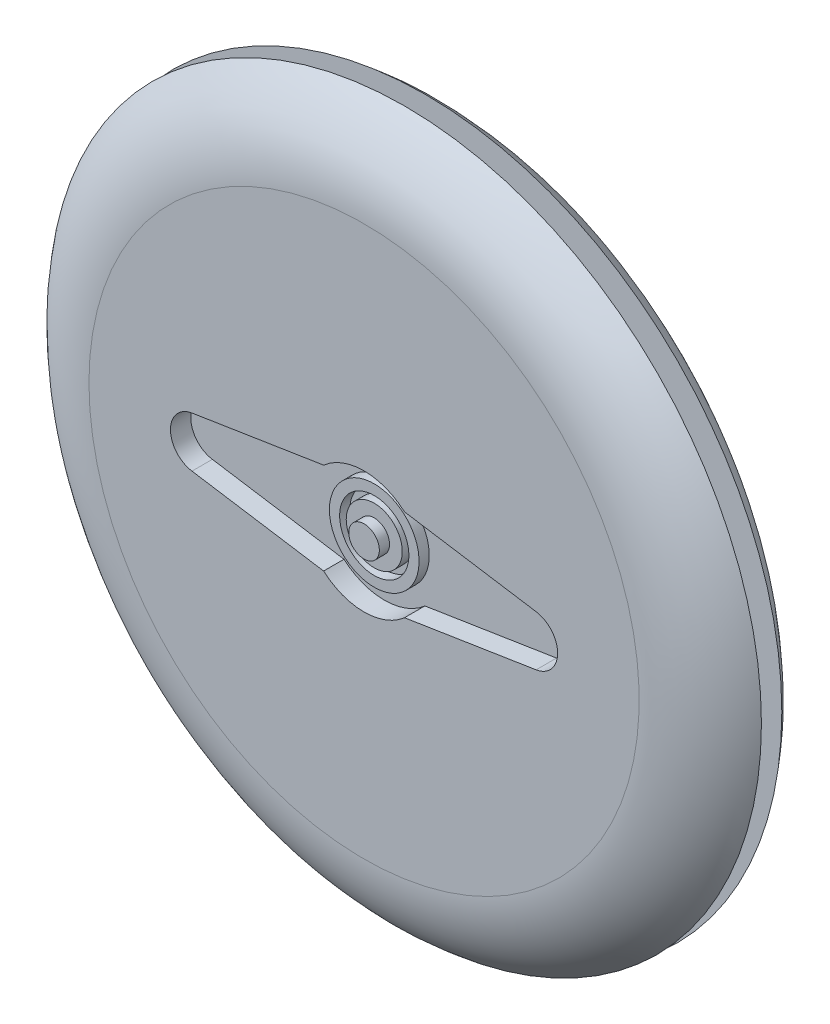
ISO-10303-21;
HEADER;
FILE_DESCRIPTION(('STEP AP214'),'2;1');
FILE_NAME('part.step','',(''),(''),'','','');
FILE_SCHEMA(('AUTOMOTIVE_DESIGN { 1 0 10303 214 1 1 1 1 }'));
ENDSEC;
DATA;
#1=APPLICATION_CONTEXT('core data for automotive mechanical design processes');
#2=APPLICATION_PROTOCOL_DEFINITION('international standard','automotive_design',2000,#1);
#3=PRODUCT_CONTEXT('',#1,'mechanical');
#4=PRODUCT('Part','Part','',(#3));
#5=PRODUCT_RELATED_PRODUCT_CATEGORY('part','',(#4));
#6=PRODUCT_DEFINITION_FORMATION('','',#4);
#7=PRODUCT_DEFINITION_CONTEXT('part definition',#1,'design');
#8=PRODUCT_DEFINITION('design','',#6,#7);
#9=PRODUCT_DEFINITION_SHAPE('','',#8);
#10=(LENGTH_UNIT() NAMED_UNIT(*) SI_UNIT(.MILLI.,.METRE.));
#11=(NAMED_UNIT(*) PLANE_ANGLE_UNIT() SI_UNIT($,.RADIAN.));
#12=(NAMED_UNIT(*) SI_UNIT($,.STERADIAN.) SOLID_ANGLE_UNIT());
#13=UNCERTAINTY_MEASURE_WITH_UNIT(LENGTH_MEASURE(1.E-05),#10,'distance_accuracy_value','');
#14=(GEOMETRIC_REPRESENTATION_CONTEXT(3) GLOBAL_UNCERTAINTY_ASSIGNED_CONTEXT((#13)) GLOBAL_UNIT_ASSIGNED_CONTEXT((#10,
#11,#12)) REPRESENTATION_CONTEXT('',''));
#15=CARTESIAN_POINT('',(0.,0.,0.));
#16=DIRECTION('',(0.,0.,1.));
#17=DIRECTION('',(1.,0.,0.));
#18=AXIS2_PLACEMENT_3D('',#15,#16,#17);
#19=CARTESIAN_POINT('',(0.,0.,-4.));
#20=DIRECTION('',(0.,0.,1.));
#21=DIRECTION('',(-1.,0.,0.));
#22=AXIS2_PLACEMENT_3D('',#19,#20,#21);
#23=PLANE('',#22);
#24=CARTESIAN_POINT('',(0.,0.,-4.));
#25=DIRECTION('',(0.,0.,-1.));
#26=DIRECTION('',(-1.,0.,0.));
#27=AXIS2_PLACEMENT_3D('',#24,#25,#26);
#28=CIRCLE('',#27,35.);
#29=CARTESIAN_POINT('',(-35.,0.,-4.));
#30=VERTEX_POINT('',#29);
#31=EDGE_CURVE('E587',#30,#30,#28,.T.);
#32=ORIENTED_EDGE('',*,*,#31,.F.);
#33=EDGE_LOOP('',(#32));
#34=FACE_BOUND('',#33,.T.);
#35=ADVANCED_FACE('F585',(#34),#23,.T.);
#36=CARTESIAN_POINT('',(0.,0.,-8.));
#37=DIRECTION('',(0.,0.,1.));
#38=DIRECTION('',(-1.,0.,0.));
#39=AXIS2_PLACEMENT_3D('',#36,#37,#38);
#40=PLANE('',#39);
#41=CARTESIAN_POINT('',(0.,0.,-8.));
#42=DIRECTION('',(0.,0.,-1.));
#43=DIRECTION('',(-1.,0.,0.));
#44=AXIS2_PLACEMENT_3D('',#41,#42,#43);
#45=CIRCLE('',#44,27.);
#46=CARTESIAN_POINT('',(-27.,0.,-8.));
#47=VERTEX_POINT('',#46);
#48=EDGE_CURVE('E12',#47,#47,#45,.F.);
#49=ORIENTED_EDGE('',*,*,#48,.F.);
#50=EDGE_LOOP('',(#49));
#51=FACE_BOUND('',#50,.T.);
#52=ADVANCED_FACE('F596',(#51),#40,.F.);
#53=CARTESIAN_POINT('',(0.,0.,2.));
#54=DIRECTION('',(0.,0.,-1.));
#55=DIRECTION('',(1.,0.,0.));
#56=AXIS2_PLACEMENT_3D('',#53,#54,#55);
#57=TOROIDAL_SURFACE('',#56,27.,10.);
#58=ORIENTED_EDGE('',*,*,#48,.T.);
#59=EDGE_LOOP('',(#58));
#60=FACE_BOUND('',#59,.T.);
#61=ORIENTED_EDGE('',*,*,#31,.T.);
#62=EDGE_LOOP('',(#61));
#63=FACE_BOUND('',#62,.T.);
#64=ADVANCED_FACE('F582',(#60,#63),#57,.T.);
#65=CLOSED_SHELL('',(#35,#52,#64));
#66=MANIFOLD_SOLID_BREP('B2',#65);
#67=CARTESIAN_POINT('',(0.,0.,0.));
#68=DIRECTION('',(0.,0.,-1.));
#69=DIRECTION('',(-1.,0.,0.));
#70=AXIS2_PLACEMENT_3D('',#67,#68,#69);
#71=PLANE('',#70);
#72=CARTESIAN_POINT('',(0.,0.,0.));
#73=DIRECTION('',(0.,0.,-1.));
#74=DIRECTION('',(-1.,0.,0.));
#75=AXIS2_PLACEMENT_3D('',#72,#73,#74);
#76=CIRCLE('',#75,2.75);
#77=CARTESIAN_POINT('',(-2.75,0.,0.));
#78=VERTEX_POINT('',#77);
#79=EDGE_CURVE('E740',#78,#78,#76,.T.);
#80=ORIENTED_EDGE('',*,*,#79,.T.);
#81=EDGE_LOOP('',(#80));
#82=FACE_BOUND('',#81,.T.);
#83=CARTESIAN_POINT('',(0.,0.,0.));
#84=DIRECTION('',(0.,0.,-1.));
#85=DIRECTION('',(-1.,0.,0.));
#86=AXIS2_PLACEMENT_3D('',#83,#84,#85);
#87=CIRCLE('',#86,3.4);
#88=CARTESIAN_POINT('',(-3.4,0.,0.));
#89=VERTEX_POINT('',#88);
#90=EDGE_CURVE('E728',#89,#89,#87,.T.);
#91=ORIENTED_EDGE('',*,*,#90,.F.);
#92=EDGE_LOOP('',(#91));
#93=FACE_BOUND('',#92,.T.);
#94=ADVANCED_FACE('F627',(#82,#93),#71,.F.);
#95=CARTESIAN_POINT('',(0.,0.,1.));
#96=DIRECTION('',(0.,0.,-1.));
#97=DIRECTION('',(-1.,0.,0.));
#98=AXIS2_PLACEMENT_3D('',#95,#96,#97);
#99=PLANE('',#98);
#100=CARTESIAN_POINT('',(0.,0.,1.));
#101=DIRECTION('',(0.,0.,-1.));
#102=DIRECTION('',(-1.,0.,0.));
#103=AXIS2_PLACEMENT_3D('',#100,#101,#102);
#104=CIRCLE('',#103,3.4);
#105=CARTESIAN_POINT('',(-3.4,0.,1.));
#106=VERTEX_POINT('',#105);
#107=EDGE_CURVE('E722',#106,#106,#104,.T.);
#108=ORIENTED_EDGE('',*,*,#107,.T.);
#109=EDGE_LOOP('',(#108));
#110=FACE_BOUND('',#109,.T.);
#111=CARTESIAN_POINT('',(0.,0.,1.));
#112=DIRECTION('',(0.,0.,-1.));
#113=DIRECTION('',(-1.,0.,0.));
#114=AXIS2_PLACEMENT_3D('',#111,#112,#113);
#115=CIRCLE('',#114,4.4);
#116=CARTESIAN_POINT('',(-4.4,0.,1.));
#117=VERTEX_POINT('',#116);
#118=EDGE_CURVE('E720',#117,#117,#115,.T.);
#119=ORIENTED_EDGE('',*,*,#118,.F.);
#120=EDGE_LOOP('',(#119));
#121=FACE_BOUND('',#120,.T.);
#122=ADVANCED_FACE('F833',(#110,#121),#99,.F.);
#123=CARTESIAN_POINT('',(0.,0.,1.));
#124=DIRECTION('',(0.,0.,-1.));
#125=DIRECTION('',(-1.,0.,0.));
#126=AXIS2_PLACEMENT_3D('',#123,#124,#125);
#127=CYLINDRICAL_SURFACE('',#126,4.4);
#128=ORIENTED_EDGE('',*,*,#118,.T.);
#129=EDGE_LOOP('',(#128));
#130=FACE_BOUND('',#129,.T.);
#131=CARTESIAN_POINT('',(0.,0.,0.));
#132=DIRECTION('',(0.,0.,-1.));
#133=DIRECTION('',(-1.,0.,0.));
#134=AXIS2_PLACEMENT_3D('',#131,#132,#133);
#135=CIRCLE('',#134,4.4);
#136=CARTESIAN_POINT('',(-4.4,0.,0.));
#137=VERTEX_POINT('',#136);
#138=EDGE_CURVE('E730',#137,#137,#135,.T.);
#139=ORIENTED_EDGE('',*,*,#138,.F.);
#140=EDGE_LOOP('',(#139));
#141=FACE_BOUND('',#140,.T.);
#142=ADVANCED_FACE('F836',(#130,#141),#127,.T.);
#143=CARTESIAN_POINT('',(0.,0.,1.));
#144=DIRECTION('',(0.,0.,-1.));
#145=DIRECTION('',(-1.,0.,0.));
#146=AXIS2_PLACEMENT_3D('',#143,#144,#145);
#147=CYLINDRICAL_SURFACE('',#146,3.4);
#148=ORIENTED_EDGE('',*,*,#107,.F.);
#149=EDGE_LOOP('',(#148));
#150=FACE_BOUND('',#149,.T.);
#151=ORIENTED_EDGE('',*,*,#90,.T.);
#152=EDGE_LOOP('',(#151));
#153=FACE_BOUND('',#152,.T.);
#154=ADVANCED_FACE('F857',(#150,#153),#147,.F.);
#155=CARTESIAN_POINT('',(0.,0.,1.));
#156=DIRECTION('',(0.,0.,-1.));
#157=DIRECTION('',(-1.,0.,0.));
#158=AXIS2_PLACEMENT_3D('',#155,#156,#157);
#159=PLANE('',#158);
#160=CARTESIAN_POINT('',(0.,0.,1.));
#161=DIRECTION('',(0.,0.,-1.));
#162=DIRECTION('',(-1.,0.,0.));
#163=AXIS2_PLACEMENT_3D('',#160,#161,#162);
#164=CIRCLE('',#163,1.5);
#165=CARTESIAN_POINT('',(-1.5,0.,1.));
#166=VERTEX_POINT('',#165);
#167=EDGE_CURVE('E739',#166,#166,#164,.F.);
#168=ORIENTED_EDGE('',*,*,#167,.F.);
#169=EDGE_LOOP('',(#168));
#170=FACE_BOUND('',#169,.T.);
#171=CARTESIAN_POINT('',(0.,0.,1.));
#172=DIRECTION('',(0.,0.,-1.));
#173=DIRECTION('',(-1.,0.,0.));
#174=AXIS2_PLACEMENT_3D('',#171,#172,#173);
#175=CIRCLE('',#174,2.75);
#176=CARTESIAN_POINT('',(-2.75,0.,1.));
#177=VERTEX_POINT('',#176);
#178=EDGE_CURVE('E735',#177,#177,#175,.T.);
#179=ORIENTED_EDGE('',*,*,#178,.F.);
#180=EDGE_LOOP('',(#179));
#181=FACE_BOUND('',#180,.T.);
#182=ADVANCED_FACE('F861',(#170,#181),#159,.F.);
#183=CARTESIAN_POINT('',(0.,0.,1.));
#184=DIRECTION('',(0.,0.,-1.));
#185=DIRECTION('',(-1.,0.,0.));
#186=AXIS2_PLACEMENT_3D('',#183,#184,#185);
#187=CYLINDRICAL_SURFACE('',#186,2.75);
#188=ORIENTED_EDGE('',*,*,#178,.T.);
#189=EDGE_LOOP('',(#188));
#190=FACE_BOUND('',#189,.T.);
#191=ORIENTED_EDGE('',*,*,#79,.F.);
#192=EDGE_LOOP('',(#191));
#193=FACE_BOUND('',#192,.T.);
#194=ADVANCED_FACE('F862',(#190,#193),#187,.T.);
#195=CARTESIAN_POINT('',(3.96862696659689,4.5,2.3));
#196=DIRECTION('',(-0.155245679095352,-0.987875892570632,0.));
#197=DIRECTION('',(0.987875892570632,-0.155245679095352,0.));
#198=AXIS2_PLACEMENT_3D('',#195,#196,#197);
#199=PLANE('',#198);
#200=DIRECTION('',(-0.987875892570632,0.155245679095352,0.));
#201=VECTOR('',#200,1.);
#202=CARTESIAN_POINT('',(0.785784342221698,5.00018688419348,2.));
#203=LINE('',#202,#201);
#204=CARTESIAN_POINT('',(16.8881141977384,2.46968973142658,2.));
#205=VERTEX_POINT('',#204);
#206=CARTESIAN_POINT('',(3.96862696659689,4.5,2.));
#207=VERTEX_POINT('',#206);
#208=EDGE_CURVE('E705',#205,#207,#203,.T.);
#209=ORIENTED_EDGE('',*,*,#208,.T.);
#210=DIRECTION('',(0.,0.,-1.));
#211=VECTOR('',#210,1.);
#212=CARTESIAN_POINT('',(3.96862696659689,4.5,2.3));
#213=LINE('',#212,#211);
#214=CARTESIAN_POINT('',(3.96862696659689,4.5,0.));
#215=VERTEX_POINT('',#214);
#216=EDGE_CURVE('E770',#207,#215,#213,.T.);
#217=ORIENTED_EDGE('',*,*,#216,.T.);
#218=DIRECTION('',(-0.987875892570632,0.155245679095352,0.));
#219=VECTOR('',#218,1.);
#220=CARTESIAN_POINT('',(3.96862696659689,4.5,0.));
#221=LINE('',#220,#219);
#222=CARTESIAN_POINT('',(16.8881141977384,2.46968973142658,0.));
#223=VERTEX_POINT('',#222);
#224=EDGE_CURVE('E716',#223,#215,#221,.T.);
#225=ORIENTED_EDGE('',*,*,#224,.F.);
#226=DIRECTION('',(0.,0.,-1.));
#227=VECTOR('',#226,1.);
#228=CARTESIAN_POINT('',(16.8881141977384,2.46968973142658,2.3));
#229=LINE('',#228,#227);
#230=EDGE_CURVE('E764',#205,#223,#229,.T.);
#231=ORIENTED_EDGE('',*,*,#230,.F.);
#232=EDGE_LOOP('',(#209,#217,#225,#231));
#233=FACE_BOUND('',#232,.T.);
#234=ADVANCED_FACE('F818',(#233),#199,.T.);
#235=CARTESIAN_POINT('',(16.5,0.,2.3));
#236=DIRECTION('',(0.,0.,-1.));
#237=DIRECTION('',(-1.,0.,0.));
#238=AXIS2_PLACEMENT_3D('',#235,#236,#237);
#239=CYLINDRICAL_SURFACE('',#238,2.5);
#240=CARTESIAN_POINT('',(16.5,0.,2.));
#241=DIRECTION('',(0.,0.,-1.));
#242=DIRECTION('',(-1.,0.,0.));
#243=AXIS2_PLACEMENT_3D('',#240,#241,#242);
#244=CIRCLE('',#243,2.5);
#245=CARTESIAN_POINT('',(16.8881141977384,-2.46968973142658,2.));
#246=VERTEX_POINT('',#245);
#247=EDGE_CURVE('E784',#246,#205,#244,.F.);
#248=ORIENTED_EDGE('',*,*,#247,.T.);
#249=ORIENTED_EDGE('',*,*,#230,.T.);
#250=CARTESIAN_POINT('',(16.5,0.,0.));
#251=DIRECTION('',(0.,0.,1.));
#252=DIRECTION('',(-1.,0.,0.));
#253=AXIS2_PLACEMENT_3D('',#250,#251,#252);
#254=CIRCLE('',#253,2.5);
#255=CARTESIAN_POINT('',(16.8881141977384,-2.46968973142658,0.));
#256=VERTEX_POINT('',#255);
#257=EDGE_CURVE('E787',#256,#223,#254,.T.);
#258=ORIENTED_EDGE('',*,*,#257,.F.);
#259=DIRECTION('',(0.,0.,-1.));
#260=VECTOR('',#259,1.);
#261=CARTESIAN_POINT('',(16.8881141977384,-2.46968973142658,2.3));
#262=LINE('',#261,#260);
#263=EDGE_CURVE('E763',#246,#256,#262,.T.);
#264=ORIENTED_EDGE('',*,*,#263,.F.);
#265=EDGE_LOOP('',(#248,#249,#258,#264));
#266=FACE_BOUND('',#265,.T.);
#267=ADVANCED_FACE('F811',(#266),#239,.F.);
#268=CARTESIAN_POINT('',(3.96862696659689,-4.5,2.3));
#269=DIRECTION('',(-0.155245679095352,0.987875892570632,0.));
#270=DIRECTION('',(-0.987875892570632,-0.155245679095352,0.));
#271=AXIS2_PLACEMENT_3D('',#268,#269,#270);
#272=PLANE('',#271);
#273=DIRECTION('',(0.987875892570632,0.155245679095352,0.));
#274=VECTOR('',#273,1.);
#275=CARTESIAN_POINT('',(0.785784342221698,-5.00018688419348,2.));
#276=LINE('',#275,#274);
#277=CARTESIAN_POINT('',(3.96862696659688,-4.5,2.));
#278=VERTEX_POINT('',#277);
#279=EDGE_CURVE('E780',#278,#246,#276,.T.);
#280=ORIENTED_EDGE('',*,*,#279,.T.);
#281=ORIENTED_EDGE('',*,*,#263,.T.);
#282=DIRECTION('',(0.987875892570632,0.155245679095352,0.));
#283=VECTOR('',#282,1.);
#284=CARTESIAN_POINT('',(3.96862696659689,-4.5,0.));
#285=LINE('',#284,#283);
#286=CARTESIAN_POINT('',(3.96862696659688,-4.5,0.));
#287=VERTEX_POINT('',#286);
#288=EDGE_CURVE('E789',#287,#256,#285,.T.);
#289=ORIENTED_EDGE('',*,*,#288,.F.);
#290=DIRECTION('',(0.,0.,-1.));
#291=VECTOR('',#290,1.);
#292=CARTESIAN_POINT('',(3.96862696659688,-4.5,2.3));
#293=LINE('',#292,#291);
#294=EDGE_CURVE('E761',#278,#287,#293,.T.);
#295=ORIENTED_EDGE('',*,*,#294,.F.);
#296=EDGE_LOOP('',(#280,#281,#289,#295));
#297=FACE_BOUND('',#296,.T.);
#298=ADVANCED_FACE('F808',(#297),#272,.T.);
#299=CARTESIAN_POINT('',(0.,0.,2.3));
#300=DIRECTION('',(0.,0.,-1.));
#301=DIRECTION('',(-1.,0.,0.));
#302=AXIS2_PLACEMENT_3D('',#299,#300,#301);
#303=CYLINDRICAL_SURFACE('',#302,6.);
#304=CARTESIAN_POINT('',(0.,0.,2.));
#305=DIRECTION('',(0.,0.,-1.));
#306=DIRECTION('',(-1.,0.,0.));
#307=AXIS2_PLACEMENT_3D('',#304,#305,#306);
#308=CIRCLE('',#307,6.);
#309=CARTESIAN_POINT('',(-3.96862696659689,-4.5,2.));
#310=VERTEX_POINT('',#309);
#311=EDGE_CURVE('E773',#310,#278,#308,.F.);
#312=ORIENTED_EDGE('',*,*,#311,.T.);
#313=ORIENTED_EDGE('',*,*,#294,.T.);
#314=CARTESIAN_POINT('',(0.,0.,0.));
#315=DIRECTION('',(0.,0.,1.));
#316=DIRECTION('',(1.,0.,0.));
#317=AXIS2_PLACEMENT_3D('',#314,#315,#316);
#318=CIRCLE('',#317,6.);
#319=CARTESIAN_POINT('',(-3.96862696659689,-4.5,0.));
#320=VERTEX_POINT('',#319);
#321=EDGE_CURVE('E792',#320,#287,#318,.T.);
#322=ORIENTED_EDGE('',*,*,#321,.F.);
#323=DIRECTION('',(0.,0.,-1.));
#324=VECTOR('',#323,1.);
#325=CARTESIAN_POINT('',(-3.96862696659689,-4.5,2.3));
#326=LINE('',#325,#324);
#327=EDGE_CURVE('E757',#310,#320,#326,.T.);
#328=ORIENTED_EDGE('',*,*,#327,.F.);
#329=EDGE_LOOP('',(#312,#313,#322,#328));
#330=FACE_BOUND('',#329,.T.);
#331=ADVANCED_FACE('F802',(#330),#303,.F.);
#332=CARTESIAN_POINT('',(-3.96862696659689,-4.5,2.3));
#333=DIRECTION('',(0.155245679095352,0.987875892570632,0.));
#334=DIRECTION('',(-0.987875892570632,0.155245679095352,0.));
#335=AXIS2_PLACEMENT_3D('',#332,#333,#334);
#336=PLANE('',#335);
#337=DIRECTION('',(0.987875892570632,-0.155245679095352,0.));
#338=VECTOR('',#337,1.);
#339=CARTESIAN_POINT('',(-0.785784342221698,-5.00018688419348,2.));
#340=LINE('',#339,#338);
#341=CARTESIAN_POINT('',(-16.8881141977384,-2.46968973142658,2.));
#342=VERTEX_POINT('',#341);
#343=EDGE_CURVE('E775',#342,#310,#340,.T.);
#344=ORIENTED_EDGE('',*,*,#343,.T.);
#345=ORIENTED_EDGE('',*,*,#327,.T.);
#346=DIRECTION('',(0.987875892570632,-0.155245679095352,0.));
#347=VECTOR('',#346,1.);
#348=CARTESIAN_POINT('',(-3.96862696659689,-4.5,0.));
#349=LINE('',#348,#347);
#350=CARTESIAN_POINT('',(-16.8881141977384,-2.46968973142658,0.));
#351=VERTEX_POINT('',#350);
#352=EDGE_CURVE('E794',#351,#320,#349,.T.);
#353=ORIENTED_EDGE('',*,*,#352,.F.);
#354=DIRECTION('',(0.,0.,-1.));
#355=VECTOR('',#354,1.);
#356=CARTESIAN_POINT('',(-16.8881141977384,-2.46968973142658,2.3));
#357=LINE('',#356,#355);
#358=EDGE_CURVE('E760',#342,#351,#357,.T.);
#359=ORIENTED_EDGE('',*,*,#358,.F.);
#360=EDGE_LOOP('',(#344,#345,#353,#359));
#361=FACE_BOUND('',#360,.T.);
#362=ADVANCED_FACE('F804',(#361),#336,.T.);
#363=CARTESIAN_POINT('',(-16.5,0.,2.3));
#364=DIRECTION('',(0.,0.,-1.));
#365=DIRECTION('',(-1.,0.,0.));
#366=AXIS2_PLACEMENT_3D('',#363,#364,#365);
#367=CYLINDRICAL_SURFACE('',#366,2.5);
#368=CARTESIAN_POINT('',(-16.5,0.,2.));
#369=DIRECTION('',(0.,0.,-1.));
#370=DIRECTION('',(-1.,0.,0.));
#371=AXIS2_PLACEMENT_3D('',#368,#369,#370);
#372=CIRCLE('',#371,2.5);
#373=CARTESIAN_POINT('',(-16.8881141977384,2.46968973142658,2.));
#374=VERTEX_POINT('',#373);
#375=EDGE_CURVE('E648',#374,#342,#372,.F.);
#376=ORIENTED_EDGE('',*,*,#375,.T.);
#377=ORIENTED_EDGE('',*,*,#358,.T.);
#378=CARTESIAN_POINT('',(-16.5,0.,0.));
#379=DIRECTION('',(0.,0.,1.));
#380=DIRECTION('',(1.,0.,0.));
#381=AXIS2_PLACEMENT_3D('',#378,#379,#380);
#382=CIRCLE('',#381,2.5);
#383=CARTESIAN_POINT('',(-16.8881141977384,2.46968973142658,0.));
#384=VERTEX_POINT('',#383);
#385=EDGE_CURVE('E714',#384,#351,#382,.T.);
#386=ORIENTED_EDGE('',*,*,#385,.F.);
#387=DIRECTION('',(0.,0.,-1.));
#388=VECTOR('',#387,1.);
#389=CARTESIAN_POINT('',(-16.8881141977384,2.46968973142658,2.3));
#390=LINE('',#389,#388);
#391=EDGE_CURVE('E702',#374,#384,#390,.T.);
#392=ORIENTED_EDGE('',*,*,#391,.F.);
#393=EDGE_LOOP('',(#376,#377,#386,#392));
#394=FACE_BOUND('',#393,.T.);
#395=ADVANCED_FACE('F800',(#394),#367,.F.);
#396=CARTESIAN_POINT('',(-3.96862696659689,4.5,2.3));
#397=DIRECTION('',(0.155245679095352,-0.987875892570632,0.));
#398=DIRECTION('',(0.987875892570632,0.155245679095352,0.));
#399=AXIS2_PLACEMENT_3D('',#396,#397,#398);
#400=PLANE('',#399);
#401=DIRECTION('',(-0.987875892570632,-0.155245679095352,0.));
#402=VECTOR('',#401,1.);
#403=CARTESIAN_POINT('',(-0.785784342221698,5.00018688419348,2.));
#404=LINE('',#403,#402);
#405=CARTESIAN_POINT('',(-3.96862696659689,4.5,2.));
#406=VERTEX_POINT('',#405);
#407=EDGE_CURVE('E641',#406,#374,#404,.T.);
#408=ORIENTED_EDGE('',*,*,#407,.T.);
#409=ORIENTED_EDGE('',*,*,#391,.T.);
#410=DIRECTION('',(-0.987875892570632,-0.155245679095352,0.));
#411=VECTOR('',#410,1.);
#412=CARTESIAN_POINT('',(-3.96862696659689,4.5,0.));
#413=LINE('',#412,#411);
#414=CARTESIAN_POINT('',(-3.96862696659689,4.5,0.));
#415=VERTEX_POINT('',#414);
#416=EDGE_CURVE('E707',#415,#384,#413,.T.);
#417=ORIENTED_EDGE('',*,*,#416,.F.);
#418=DIRECTION('',(0.,0.,-1.));
#419=VECTOR('',#418,1.);
#420=CARTESIAN_POINT('',(-3.96862696659689,4.5,2.3));
#421=LINE('',#420,#419);
#422=EDGE_CURVE('E692',#406,#415,#421,.T.);
#423=ORIENTED_EDGE('',*,*,#422,.F.);
#424=EDGE_LOOP('',(#408,#409,#417,#423));
#425=FACE_BOUND('',#424,.T.);
#426=ADVANCED_FACE('F710',(#425),#400,.T.);
#427=CARTESIAN_POINT('',(0.,0.,2.3));
#428=DIRECTION('',(0.,0.,-1.));
#429=DIRECTION('',(-1.,0.,0.));
#430=AXIS2_PLACEMENT_3D('',#427,#428,#429);
#431=CYLINDRICAL_SURFACE('',#430,6.00000000000002);
#432=CARTESIAN_POINT('',(0.,0.,2.));
#433=DIRECTION('',(0.,0.,-1.));
#434=DIRECTION('',(-1.,0.,0.));
#435=AXIS2_PLACEMENT_3D('',#432,#433,#434);
#436=CIRCLE('',#435,6.00000000000002);
#437=EDGE_CURVE('E699',#207,#406,#436,.F.);
#438=ORIENTED_EDGE('',*,*,#437,.T.);
#439=ORIENTED_EDGE('',*,*,#422,.T.);
#440=CARTESIAN_POINT('',(0.,0.,0.));
#441=DIRECTION('',(0.,0.,1.));
#442=DIRECTION('',(-1.,0.,0.));
#443=AXIS2_PLACEMENT_3D('',#440,#441,#442);
#444=CIRCLE('',#443,6.00000000000002);
#445=EDGE_CURVE('E697',#215,#415,#444,.T.);
#446=ORIENTED_EDGE('',*,*,#445,.F.);
#447=ORIENTED_EDGE('',*,*,#216,.F.);
#448=EDGE_LOOP('',(#438,#439,#446,#447));
#449=FACE_BOUND('',#448,.T.);
#450=ADVANCED_FACE('F696',(#449),#431,.F.);
#451=ORIENTED_EDGE('',*,*,#138,.T.);
#452=EDGE_LOOP('',(#451));
#453=FACE_BOUND('',#452,.T.);
#454=ORIENTED_EDGE('',*,*,#445,.T.);
#455=ORIENTED_EDGE('',*,*,#416,.T.);
#456=ORIENTED_EDGE('',*,*,#385,.T.);
#457=ORIENTED_EDGE('',*,*,#352,.T.);
#458=ORIENTED_EDGE('',*,*,#321,.T.);
#459=ORIENTED_EDGE('',*,*,#288,.T.);
#460=ORIENTED_EDGE('',*,*,#257,.T.);
#461=ORIENTED_EDGE('',*,*,#224,.T.);
#462=EDGE_LOOP('',(#454,#455,#456,#457,#458,#459,#460,#461));
#463=FACE_BOUND('',#462,.T.);
#464=ADVANCED_FACE('F713',(#453,#463),#71,.F.);
#465=CARTESIAN_POINT('',(0.,0.,2.3));
#466=DIRECTION('',(0.,0.,-1.));
#467=DIRECTION('',(-1.,0.,0.));
#468=AXIS2_PLACEMENT_3D('',#465,#466,#467);
#469=CYLINDRICAL_SURFACE('',#468,1.5);
#470=CARTESIAN_POINT('',(0.,0.,2.));
#471=DIRECTION('',(0.,0.,-1.));
#472=DIRECTION('',(-1.,0.,0.));
#473=AXIS2_PLACEMENT_3D('',#470,#471,#472);
#474=CIRCLE('',#473,1.5);
#475=CARTESIAN_POINT('',(-1.5,0.,2.));
#476=VERTEX_POINT('',#475);
#477=EDGE_CURVE('E751',#476,#476,#474,.F.);
#478=ORIENTED_EDGE('',*,*,#477,.F.);
#479=EDGE_LOOP('',(#478));
#480=FACE_BOUND('',#479,.T.);
#481=ORIENTED_EDGE('',*,*,#167,.T.);
#482=EDGE_LOOP('',(#481));
#483=FACE_BOUND('',#482,.T.);
#484=ADVANCED_FACE('F828',(#480,#483),#469,.T.);
#485=CARTESIAN_POINT('',(0.,0.,-2.));
#486=DIRECTION('',(0.,0.,-1.));
#487=DIRECTION('',(-1.,0.,0.));
#488=AXIS2_PLACEMENT_3D('',#485,#486,#487);
#489=PLANE('',#488);
#490=CARTESIAN_POINT('',(0.,0.,-2.));
#491=DIRECTION('',(0.,0.,-1.));
#492=DIRECTION('',(-1.,0.,0.));
#493=AXIS2_PLACEMENT_3D('',#490,#491,#492);
#494=CIRCLE('',#493,25.);
#495=CARTESIAN_POINT('',(-25.,0.,-2.));
#496=VERTEX_POINT('',#495);
#497=EDGE_CURVE('E741',#496,#496,#494,.T.);
#498=ORIENTED_EDGE('',*,*,#497,.F.);
#499=EDGE_LOOP('',(#498));
#500=FACE_BOUND('',#499,.T.);
#501=CARTESIAN_POINT('',(0.,0.,-2.));
#502=DIRECTION('',(0.,0.,-1.));
#503=DIRECTION('',(-1.,0.,0.));
#504=AXIS2_PLACEMENT_3D('',#501,#502,#503);
#505=CIRCLE('',#504,35.);
#506=CARTESIAN_POINT('',(-35.,0.,-2.));
#507=VERTEX_POINT('',#506);
#508=EDGE_CURVE('E640',#507,#507,#505,.T.);
#509=ORIENTED_EDGE('',*,*,#508,.T.);
#510=EDGE_LOOP('',(#509));
#511=FACE_BOUND('',#510,.T.);
#512=ADVANCED_FACE('F817',(#500,#511),#489,.T.);
#513=CARTESIAN_POINT('',(0.,0.,2.));
#514=DIRECTION('',(0.,0.,-1.));
#515=DIRECTION('',(-1.,0.,0.));
#516=AXIS2_PLACEMENT_3D('',#513,#514,#515);
#517=PLANE('',#516);
#518=CARTESIAN_POINT('',(0.,0.,2.));
#519=DIRECTION('',(0.,0.,-1.));
#520=DIRECTION('',(-1.,0.,0.));
#521=AXIS2_PLACEMENT_3D('',#518,#519,#520);
#522=CIRCLE('',#521,27.);
#523=CARTESIAN_POINT('',(-27.,0.,2.));
#524=VERTEX_POINT('',#523);
#525=EDGE_CURVE('E584',#524,#524,#522,.F.);
#526=ORIENTED_EDGE('',*,*,#525,.T.);
#527=EDGE_LOOP('',(#526));
#528=FACE_BOUND('',#527,.T.);
#529=ORIENTED_EDGE('',*,*,#437,.F.);
#530=ORIENTED_EDGE('',*,*,#208,.F.);
#531=ORIENTED_EDGE('',*,*,#247,.F.);
#532=ORIENTED_EDGE('',*,*,#279,.F.);
#533=ORIENTED_EDGE('',*,*,#311,.F.);
#534=ORIENTED_EDGE('',*,*,#343,.F.);
#535=ORIENTED_EDGE('',*,*,#375,.F.);
#536=ORIENTED_EDGE('',*,*,#407,.F.);
#537=EDGE_LOOP('',(#529,#530,#531,#532,#533,#534,#535,#536));
#538=FACE_BOUND('',#537,.T.);
#539=ADVANCED_FACE('F820',(#528,#538),#517,.F.);
#540=ORIENTED_EDGE('',*,*,#477,.T.);
#541=EDGE_LOOP('',(#540));
#542=FACE_BOUND('',#541,.T.);
#543=ADVANCED_FACE('F819',(#542),#517,.F.);
#544=CARTESIAN_POINT('',(0.,0.,-8.));
#545=DIRECTION('',(0.,0.,1.));
#546=DIRECTION('',(1.,0.,0.));
#547=AXIS2_PLACEMENT_3D('',#544,#545,#546);
#548=TOROIDAL_SURFACE('',#547,27.,10.);
#549=ORIENTED_EDGE('',*,*,#525,.F.);
#550=EDGE_LOOP('',(#549));
#551=FACE_BOUND('',#550,.T.);
#552=ORIENTED_EDGE('',*,*,#508,.F.);
#553=EDGE_LOOP('',(#552));
#554=FACE_BOUND('',#553,.T.);
#555=ADVANCED_FACE('F631',(#551,#554),#548,.T.);
#556=CARTESIAN_POINT('',(0.,0.,-4.));
#557=DIRECTION('',(0.,0.,1.));
#558=DIRECTION('',(1.,0.,0.));
#559=AXIS2_PLACEMENT_3D('',#556,#557,#558);
#560=CYLINDRICAL_SURFACE('',#559,25.);
#561=CARTESIAN_POINT('',(0.,0.,-4.));
#562=DIRECTION('',(0.,0.,-1.));
#563=DIRECTION('',(-1.,0.,0.));
#564=AXIS2_PLACEMENT_3D('',#561,#562,#563);
#565=CIRCLE('',#564,25.);
#566=CARTESIAN_POINT('',(-25.,0.,-4.));
#567=VERTEX_POINT('',#566);
#568=EDGE_CURVE('E737',#567,#567,#565,.T.);
#569=ORIENTED_EDGE('',*,*,#568,.F.);
#570=EDGE_LOOP('',(#569));
#571=FACE_BOUND('',#570,.T.);
#572=ORIENTED_EDGE('',*,*,#497,.T.);
#573=EDGE_LOOP('',(#572));
#574=FACE_BOUND('',#573,.T.);
#575=ADVANCED_FACE('F976',(#571,#574),#560,.T.);
#576=CARTESIAN_POINT('',(0.,0.,-4.));
#577=DIRECTION('',(0.,0.,-1.));
#578=DIRECTION('',(-1.,0.,0.));
#579=AXIS2_PLACEMENT_3D('',#576,#577,#578);
#580=PLANE('',#579);
#581=ORIENTED_EDGE('',*,*,#568,.T.);
#582=EDGE_LOOP('',(#581));
#583=FACE_BOUND('',#582,.T.);
#584=ADVANCED_FACE('F987',(#583),#580,.T.);
#585=CLOSED_SHELL('',(#94,#122,#142,#154,#182,#194,#234,#267,#298,#331,#362,#395,#426,#450,#464,
#484,#512,#539,#543,#555,#575,#584));
#586=MANIFOLD_SOLID_BREP('B7',#585);
#587=ADVANCED_BREP_SHAPE_REPRESENTATION('',(#18,#66,#586),#14);
#588=SHAPE_DEFINITION_REPRESENTATION(#9,#587);
ENDSEC;
END-ISO-10303-21;
